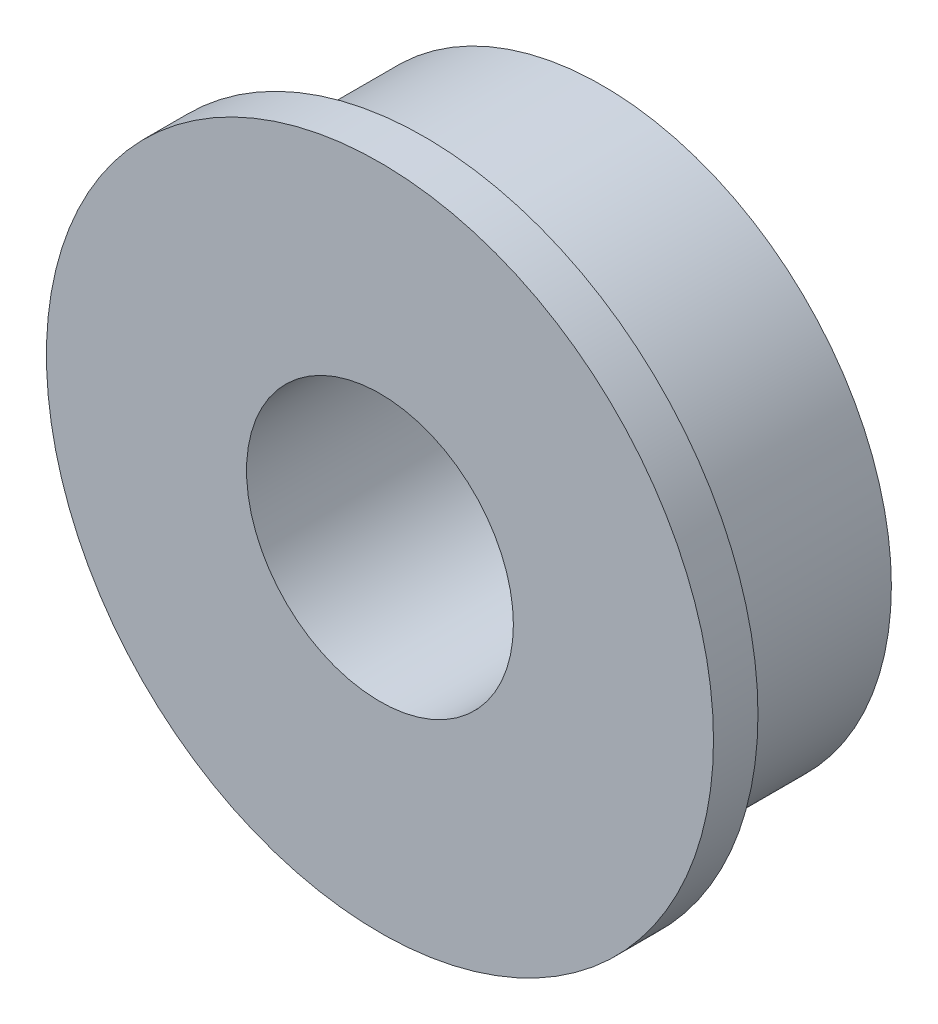
ISO-10303-21;
HEADER;
FILE_DESCRIPTION(('STEP AP214'),'2;1');
FILE_NAME('part.step','',(''),(''),'','','');
FILE_SCHEMA(('AUTOMOTIVE_DESIGN { 1 0 10303 214 1 1 1 1 }'));
ENDSEC;
DATA;
#1=APPLICATION_CONTEXT('core data for automotive mechanical design processes');
#2=APPLICATION_PROTOCOL_DEFINITION('international standard','automotive_design',2000,#1);
#3=PRODUCT_CONTEXT('',#1,'mechanical');
#4=PRODUCT('Part','Part','',(#3));
#5=PRODUCT_RELATED_PRODUCT_CATEGORY('part','',(#4));
#6=PRODUCT_DEFINITION_FORMATION('','',#4);
#7=PRODUCT_DEFINITION_CONTEXT('part definition',#1,'design');
#8=PRODUCT_DEFINITION('design','',#6,#7);
#9=PRODUCT_DEFINITION_SHAPE('','',#8);
#10=(LENGTH_UNIT() NAMED_UNIT(*) SI_UNIT(.MILLI.,.METRE.));
#11=(NAMED_UNIT(*) PLANE_ANGLE_UNIT() SI_UNIT($,.RADIAN.));
#12=(NAMED_UNIT(*) SI_UNIT($,.STERADIAN.) SOLID_ANGLE_UNIT());
#13=UNCERTAINTY_MEASURE_WITH_UNIT(LENGTH_MEASURE(1.E-05),#10,'distance_accuracy_value','');
#14=(GEOMETRIC_REPRESENTATION_CONTEXT(3) GLOBAL_UNCERTAINTY_ASSIGNED_CONTEXT((#13)) GLOBAL_UNIT_ASSIGNED_CONTEXT((#10,
#11,#12)) REPRESENTATION_CONTEXT('',''));
#15=CARTESIAN_POINT('',(0.,0.,0.));
#16=DIRECTION('',(0.,0.,1.));
#17=DIRECTION('',(1.,0.,0.));
#18=AXIS2_PLACEMENT_3D('',#15,#16,#17);
#19=CARTESIAN_POINT('',(0.,0.,0.));
#20=DIRECTION('',(0.,0.,1.));
#21=DIRECTION('',(1.,0.,0.));
#22=AXIS2_PLACEMENT_3D('',#19,#20,#21);
#23=CYLINDRICAL_SURFACE('',#22,3.);
#24=CARTESIAN_POINT('',(0.,0.,-5.));
#25=DIRECTION('',(0.,0.,1.));
#26=DIRECTION('',(1.,0.,0.));
#27=AXIS2_PLACEMENT_3D('',#24,#25,#26);
#28=CIRCLE('',#27,3.);
#29=CARTESIAN_POINT('',(3.,0.,-5.));
#30=VERTEX_POINT('',#29);
#31=EDGE_CURVE('E59',#30,#30,#28,.T.);
#32=ORIENTED_EDGE('',*,*,#31,.F.);
#33=EDGE_LOOP('',(#32));
#34=FACE_BOUND('',#33,.T.);
#35=CARTESIAN_POINT('',(0.,0.,0.));
#36=DIRECTION('',(0.,0.,1.));
#37=DIRECTION('',(1.,0.,0.));
#38=AXIS2_PLACEMENT_3D('',#35,#36,#37);
#39=CIRCLE('',#38,3.);
#40=CARTESIAN_POINT('',(3.,0.,0.));
#41=VERTEX_POINT('',#40);
#42=EDGE_CURVE('E10',#41,#41,#39,.T.);
#43=ORIENTED_EDGE('',*,*,#42,.T.);
#44=EDGE_LOOP('',(#43));
#45=FACE_BOUND('',#44,.T.);
#46=ADVANCED_FACE('F37',(#34,#45),#23,.F.);
#47=CARTESIAN_POINT('',(0.,3.,0.));
#48=DIRECTION('',(0.,0.,-1.));
#49=DIRECTION('',(-1.,0.,0.));
#50=AXIS2_PLACEMENT_3D('',#47,#48,#49);
#51=PLANE('',#50);
#52=ORIENTED_EDGE('',*,*,#42,.F.);
#53=EDGE_LOOP('',(#52));
#54=FACE_BOUND('',#53,.T.);
#55=CARTESIAN_POINT('',(0.,0.,0.));
#56=DIRECTION('',(0.,0.,1.));
#57=DIRECTION('',(1.,0.,0.));
#58=AXIS2_PLACEMENT_3D('',#55,#56,#57);
#59=CIRCLE('',#58,7.5);
#60=CARTESIAN_POINT('',(7.5,0.,0.));
#61=VERTEX_POINT('',#60);
#62=EDGE_CURVE('E43',#61,#61,#59,.T.);
#63=ORIENTED_EDGE('',*,*,#62,.T.);
#64=EDGE_LOOP('',(#63));
#65=FACE_BOUND('',#64,.T.);
#66=ADVANCED_FACE('F66',(#54,#65),#51,.F.);
#67=CARTESIAN_POINT('',(0.,0.,0.));
#68=DIRECTION('',(0.,0.,1.));
#69=DIRECTION('',(1.,0.,0.));
#70=AXIS2_PLACEMENT_3D('',#67,#68,#69);
#71=CYLINDRICAL_SURFACE('',#70,7.5);
#72=ORIENTED_EDGE('',*,*,#62,.F.);
#73=EDGE_LOOP('',(#72));
#74=FACE_BOUND('',#73,.T.);
#75=CARTESIAN_POINT('',(0.,0.,-1.));
#76=DIRECTION('',(0.,0.,1.));
#77=DIRECTION('',(1.,0.,0.));
#78=AXIS2_PLACEMENT_3D('',#75,#76,#77);
#79=CIRCLE('',#78,7.5);
#80=CARTESIAN_POINT('',(7.5,0.,-1.));
#81=VERTEX_POINT('',#80);
#82=EDGE_CURVE('E47',#81,#81,#79,.T.);
#83=ORIENTED_EDGE('',*,*,#82,.T.);
#84=EDGE_LOOP('',(#83));
#85=FACE_BOUND('',#84,.T.);
#86=ADVANCED_FACE('F70',(#74,#85),#71,.T.);
#87=CARTESIAN_POINT('',(0.,7.5,-1.));
#88=DIRECTION('',(0.,0.,1.));
#89=DIRECTION('',(1.,0.,0.));
#90=AXIS2_PLACEMENT_3D('',#87,#88,#89);
#91=PLANE('',#90);
#92=ORIENTED_EDGE('',*,*,#82,.F.);
#93=EDGE_LOOP('',(#92));
#94=FACE_BOUND('',#93,.T.);
#95=CARTESIAN_POINT('',(0.,0.,-1.));
#96=DIRECTION('',(0.,0.,1.));
#97=DIRECTION('',(1.,0.,0.));
#98=AXIS2_PLACEMENT_3D('',#95,#96,#97);
#99=CIRCLE('',#98,6.5);
#100=CARTESIAN_POINT('',(6.5,0.,-1.));
#101=VERTEX_POINT('',#100);
#102=EDGE_CURVE('E51',#101,#101,#99,.T.);
#103=ORIENTED_EDGE('',*,*,#102,.T.);
#104=EDGE_LOOP('',(#103));
#105=FACE_BOUND('',#104,.T.);
#106=ADVANCED_FACE('F75',(#94,#105),#91,.F.);
#107=CARTESIAN_POINT('',(0.,0.,0.));
#108=DIRECTION('',(0.,0.,1.));
#109=DIRECTION('',(1.,0.,0.));
#110=AXIS2_PLACEMENT_3D('',#107,#108,#109);
#111=CYLINDRICAL_SURFACE('',#110,6.5);
#112=ORIENTED_EDGE('',*,*,#102,.F.);
#113=EDGE_LOOP('',(#112));
#114=FACE_BOUND('',#113,.T.);
#115=CARTESIAN_POINT('',(0.,0.,-5.));
#116=DIRECTION('',(0.,0.,1.));
#117=DIRECTION('',(1.,0.,0.));
#118=AXIS2_PLACEMENT_3D('',#115,#116,#117);
#119=CIRCLE('',#118,6.5);
#120=CARTESIAN_POINT('',(6.5,0.,-5.));
#121=VERTEX_POINT('',#120);
#122=EDGE_CURVE('E56',#121,#121,#119,.T.);
#123=ORIENTED_EDGE('',*,*,#122,.T.);
#124=EDGE_LOOP('',(#123));
#125=FACE_BOUND('',#124,.T.);
#126=ADVANCED_FACE('F81',(#114,#125),#111,.T.);
#127=CARTESIAN_POINT('',(0.,6.5,-5.));
#128=DIRECTION('',(0.,0.,1.));
#129=DIRECTION('',(1.,0.,0.));
#130=AXIS2_PLACEMENT_3D('',#127,#128,#129);
#131=PLANE('',#130);
#132=ORIENTED_EDGE('',*,*,#122,.F.);
#133=EDGE_LOOP('',(#132));
#134=FACE_BOUND('',#133,.T.);
#135=ORIENTED_EDGE('',*,*,#31,.T.);
#136=EDGE_LOOP('',(#135));
#137=FACE_BOUND('',#136,.T.);
#138=ADVANCED_FACE('F63',(#134,#137),#131,.F.);
#139=CLOSED_SHELL('',(#46,#66,#86,#106,#126,#138));
#140=MANIFOLD_SOLID_BREP('B2',#139);
#141=ADVANCED_BREP_SHAPE_REPRESENTATION('',(#18,#140),#14);
#142=SHAPE_DEFINITION_REPRESENTATION(#9,#141);
ENDSEC;
END-ISO-10303-21;
